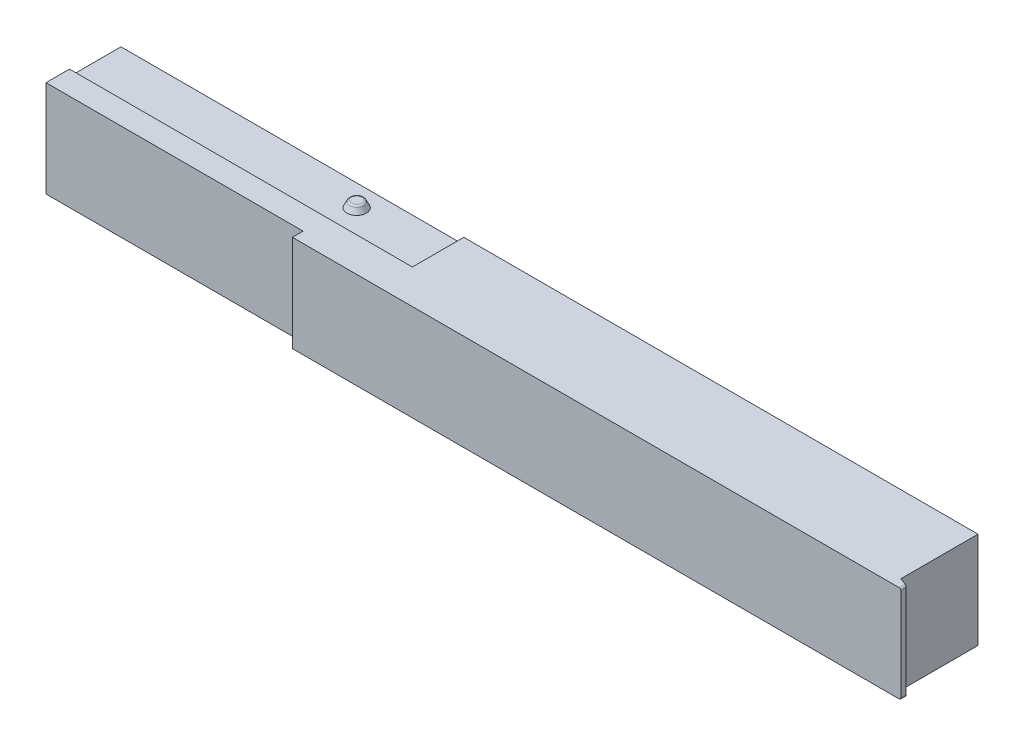
ISO-10303-21;
HEADER;
FILE_DESCRIPTION(('STEP AP214'),'2;1');
FILE_NAME('part.step','',(''),(''),'','','');
FILE_SCHEMA(('AUTOMOTIVE_DESIGN { 1 0 10303 214 1 1 1 1 }'));
ENDSEC;
DATA;
#1=APPLICATION_CONTEXT('core data for automotive mechanical design processes');
#2=APPLICATION_PROTOCOL_DEFINITION('international standard','automotive_design',2000,#1);
#3=PRODUCT_CONTEXT('',#1,'mechanical');
#4=PRODUCT('Part','Part','',(#3));
#5=PRODUCT_RELATED_PRODUCT_CATEGORY('part','',(#4));
#6=PRODUCT_DEFINITION_FORMATION('','',#4);
#7=PRODUCT_DEFINITION_CONTEXT('part definition',#1,'design');
#8=PRODUCT_DEFINITION('design','',#6,#7);
#9=PRODUCT_DEFINITION_SHAPE('','',#8);
#10=(LENGTH_UNIT() NAMED_UNIT(*) SI_UNIT(.MILLI.,.METRE.));
#11=(NAMED_UNIT(*) PLANE_ANGLE_UNIT() SI_UNIT($,.RADIAN.));
#12=(NAMED_UNIT(*) SI_UNIT($,.STERADIAN.) SOLID_ANGLE_UNIT());
#13=UNCERTAINTY_MEASURE_WITH_UNIT(LENGTH_MEASURE(1.E-05),#10,'distance_accuracy_value','');
#14=(GEOMETRIC_REPRESENTATION_CONTEXT(3) GLOBAL_UNCERTAINTY_ASSIGNED_CONTEXT((#13)) GLOBAL_UNIT_ASSIGNED_CONTEXT((#10,
#11,#12)) REPRESENTATION_CONTEXT('',''));
#15=CARTESIAN_POINT('',(0.,0.,0.));
#16=DIRECTION('',(0.,0.,1.));
#17=DIRECTION('',(1.,0.,0.));
#18=AXIS2_PLACEMENT_3D('',#15,#16,#17);
#19=CARTESIAN_POINT('',(-32.6667343634635,15.4764947855641,16.0620123996754));
#20=DIRECTION('',(0.,-1.,0.));
#21=DIRECTION('',(1.,0.,0.));
#22=AXIS2_PLACEMENT_3D('',#19,#20,#21);
#23=PLANE('',#22);
#24=DIRECTION('',(0.,0.,1.));
#25=VECTOR('',#24,1.);
#26=CARTESIAN_POINT('',(-32.6667343634635,15.4764947855641,16.0620123996754));
#27=LINE('',#26,#25);
#28=CARTESIAN_POINT('',(-32.6667343634635,15.4764947855641,28.0620123996754));
#29=VERTEX_POINT('',#28);
#30=CARTESIAN_POINT('',(-32.6667343634635,15.4764947855641,33.5620123996754));
#31=VERTEX_POINT('',#30);
#32=EDGE_CURVE('E277',#29,#31,#27,.T.);
#33=ORIENTED_EDGE('',*,*,#32,.F.);
#34=DIRECTION('',(1.,0.,0.));
#35=VECTOR('',#34,1.);
#36=CARTESIAN_POINT('',(-32.6667343634635,15.4764947855641,28.0620123996754));
#37=LINE('',#36,#35);
#38=CARTESIAN_POINT('',(47.3332656365365,15.4764947855641,28.0620123996754));
#39=VERTEX_POINT('',#38);
#40=EDGE_CURVE('E467',#29,#39,#37,.T.);
#41=ORIENTED_EDGE('',*,*,#40,.T.);
#42=DIRECTION('',(0.,0.,-1.));
#43=VECTOR('',#42,1.);
#44=CARTESIAN_POINT('',(47.3332656365365,15.4764947855641,16.0620123996754));
#45=LINE('',#44,#43);
#46=CARTESIAN_POINT('',(47.3332656365365,15.4764947855641,16.0620123996754));
#47=VERTEX_POINT('',#46);
#48=EDGE_CURVE('E471',#39,#47,#45,.T.);
#49=ORIENTED_EDGE('',*,*,#48,.T.);
#50=DIRECTION('',(1.,0.,0.));
#51=VECTOR('',#50,1.);
#52=CARTESIAN_POINT('',(-32.6667343634635,15.4764947855641,16.0620123996754));
#53=LINE('',#52,#51);
#54=CARTESIAN_POINT('',(167.333265636537,15.4764947855641,16.0620123996754));
#55=VERTEX_POINT('',#54);
#56=EDGE_CURVE('E191',#47,#55,#53,.T.);
#57=ORIENTED_EDGE('',*,*,#56,.T.);
#58=DIRECTION('',(0.,0.,1.));
#59=VECTOR('',#58,1.);
#60=CARTESIAN_POINT('',(167.333265636537,15.4764947855641,16.0620123996754));
#61=LINE('',#60,#59);
#62=CARTESIAN_POINT('',(167.333265636537,15.4764947855641,34.084071931143));
#63=VERTEX_POINT('',#62);
#64=EDGE_CURVE('E256',#55,#63,#61,.T.);
#65=ORIENTED_EDGE('',*,*,#64,.T.);
#66=DIRECTION('',(-0.939692620785909,0.,-0.342020143325667));
#67=VECTOR('',#66,1.);
#68=CARTESIAN_POINT('',(-15.0633569592918,15.4764947855641,-32.3028695244243));
#69=LINE('',#68,#67);
#70=CARTESIAN_POINT('',(168.933265636536,15.4764947855641,34.6664243059689));
#71=VERTEX_POINT('',#70);
#72=EDGE_CURVE('E298',#63,#71,#69,.F.);
#73=ORIENTED_EDGE('',*,*,#72,.T.);
#74=DIRECTION('',(0.,0.,1.));
#75=VECTOR('',#74,1.);
#76=CARTESIAN_POINT('',(168.933265636536,15.4764947855641,16.0620123996754));
#77=LINE('',#76,#75);
#78=CARTESIAN_POINT('',(168.933265636536,15.4764947855641,36.0620123996754));
#79=VERTEX_POINT('',#78);
#80=EDGE_CURVE('E306',#71,#79,#77,.T.);
#81=ORIENTED_EDGE('',*,*,#80,.T.);
#82=DIRECTION('',(1.,0.,0.));
#83=VECTOR('',#82,1.);
#84=CARTESIAN_POINT('',(-32.6667343634635,15.4764947855641,36.0620123996754));
#85=LINE('',#84,#83);
#86=CARTESIAN_POINT('',(27.3332656365365,15.4764947855641,36.0620123996754));
#87=VERTEX_POINT('',#86);
#88=EDGE_CURVE('E272',#87,#79,#85,.T.);
#89=ORIENTED_EDGE('',*,*,#88,.F.);
#90=DIRECTION('',(0.,0.,-1.));
#91=VECTOR('',#90,1.);
#92=CARTESIAN_POINT('',(27.3332656365365,15.4764947855641,36.0620123996754));
#93=LINE('',#92,#91);
#94=CARTESIAN_POINT('',(27.3332656365365,15.4764947855641,33.5620123996754));
#95=VERTEX_POINT('',#94);
#96=EDGE_CURVE('E238',#87,#95,#93,.T.);
#97=ORIENTED_EDGE('',*,*,#96,.T.);
#98=DIRECTION('',(-1.,0.,0.));
#99=VECTOR('',#98,1.);
#100=CARTESIAN_POINT('',(27.3332656365365,15.4764947855641,33.5620123996754));
#101=LINE('',#100,#99);
#102=EDGE_CURVE('E243',#95,#31,#101,.T.);
#103=ORIENTED_EDGE('',*,*,#102,.T.);
#104=EDGE_LOOP('',(#33,#41,#49,#57,#65,#73,#81,#89,#97,#103));
#105=FACE_BOUND('',#104,.T.);
#106=ADVANCED_FACE('F55',(#105),#23,.T.);
#107=CARTESIAN_POINT('',(-32.6667343634635,15.4764947855641,16.0620123996754));
#108=DIRECTION('',(1.,0.,0.));
#109=DIRECTION('',(0.,0.,-1.));
#110=AXIS2_PLACEMENT_3D('',#107,#108,#109);
#111=PLANE('',#110);
#112=DIRECTION('',(0.,-1.,0.));
#113=VECTOR('',#112,1.);
#114=CARTESIAN_POINT('',(-32.6667343634635,16.9764947855641,28.0620123996754));
#115=LINE('',#114,#113);
#116=CARTESIAN_POINT('',(-32.6667343634635,16.9764947855641,28.0620123996754));
#117=VERTEX_POINT('',#116);
#118=EDGE_CURVE('E196',#117,#29,#115,.T.);
#119=ORIENTED_EDGE('',*,*,#118,.T.);
#120=ORIENTED_EDGE('',*,*,#32,.T.);
#121=DIRECTION('',(0.,1.,0.));
#122=VECTOR('',#121,1.);
#123=CARTESIAN_POINT('',(-32.6667343634635,-44.5755659617575,33.5620123996754));
#124=LINE('',#123,#122);
#125=CARTESIAN_POINT('',(-32.6667343634635,37.9764947855641,33.5620123996754));
#126=VERTEX_POINT('',#125);
#127=EDGE_CURVE('E247',#31,#126,#124,.T.);
#128=ORIENTED_EDGE('',*,*,#127,.T.);
#129=DIRECTION('',(0.,0.,1.));
#130=VECTOR('',#129,1.);
#131=CARTESIAN_POINT('',(-32.6667343634635,37.9764947855641,16.0620123996754));
#132=LINE('',#131,#130);
#133=CARTESIAN_POINT('',(-32.6667343634635,37.9764947855641,28.0620123996754));
#134=VERTEX_POINT('',#133);
#135=EDGE_CURVE('E288',#134,#126,#132,.T.);
#136=ORIENTED_EDGE('',*,*,#135,.F.);
#137=DIRECTION('',(0.,1.,0.));
#138=VECTOR('',#137,1.);
#139=CARTESIAN_POINT('',(-32.6667343634635,36.4764947855641,28.0620123996754));
#140=LINE('',#139,#138);
#141=CARTESIAN_POINT('',(-32.6667343634635,36.4764947855641,28.0620123996754));
#142=VERTEX_POINT('',#141);
#143=EDGE_CURVE('E214',#142,#134,#140,.T.);
#144=ORIENTED_EDGE('',*,*,#143,.F.);
#145=DIRECTION('',(0.,0.,1.));
#146=VECTOR('',#145,1.);
#147=CARTESIAN_POINT('',(-32.6667343634635,36.4764947855641,16.0620123996754));
#148=LINE('',#147,#146);
#149=CARTESIAN_POINT('',(-32.6667343634635,36.4764947855641,16.0620123996754));
#150=VERTEX_POINT('',#149);
#151=EDGE_CURVE('E201',#150,#142,#148,.T.);
#152=ORIENTED_EDGE('',*,*,#151,.F.);
#153=DIRECTION('',(0.,1.,0.));
#154=VECTOR('',#153,1.);
#155=CARTESIAN_POINT('',(-32.6667343634635,15.4764947855641,16.0620123996754));
#156=LINE('',#155,#154);
#157=CARTESIAN_POINT('',(-32.6667343634635,16.9764947855641,16.0620123996754));
#158=VERTEX_POINT('',#157);
#159=EDGE_CURVE('E268',#158,#150,#156,.T.);
#160=ORIENTED_EDGE('',*,*,#159,.F.);
#161=DIRECTION('',(0.,0.,1.));
#162=VECTOR('',#161,1.);
#163=CARTESIAN_POINT('',(-32.6667343634635,16.9764947855641,16.0620123996754));
#164=LINE('',#163,#162);
#165=EDGE_CURVE('E71',#158,#117,#164,.T.);
#166=ORIENTED_EDGE('',*,*,#165,.T.);
#167=EDGE_LOOP('',(#119,#120,#128,#136,#144,#152,#160,#166));
#168=FACE_BOUND('',#167,.T.);
#169=ADVANCED_FACE('F416',(#168),#111,.F.);
#170=CARTESIAN_POINT('',(-32.6667343634635,15.4764947855641,16.0620123996754));
#171=DIRECTION('',(0.,0.,-1.));
#172=DIRECTION('',(-1.,0.,0.));
#173=AXIS2_PLACEMENT_3D('',#170,#171,#172);
#174=PLANE('',#173);
#175=ORIENTED_EDGE('',*,*,#56,.F.);
#176=DIRECTION('',(0.,-1.,0.));
#177=VECTOR('',#176,1.);
#178=CARTESIAN_POINT('',(47.3332656365365,16.9764947855641,16.0620123996754));
#179=LINE('',#178,#177);
#180=CARTESIAN_POINT('',(47.3332656365365,16.9764947855641,16.0620123996754));
#181=VERTEX_POINT('',#180);
#182=EDGE_CURVE('E176',#181,#47,#179,.T.);
#183=ORIENTED_EDGE('',*,*,#182,.F.);
#184=DIRECTION('',(-1.,0.,0.));
#185=VECTOR('',#184,1.);
#186=CARTESIAN_POINT('',(-32.6667343634635,16.9764947855641,16.0620123996754));
#187=LINE('',#186,#185);
#188=EDGE_CURVE('E181',#181,#158,#187,.T.);
#189=ORIENTED_EDGE('',*,*,#188,.T.);
#190=ORIENTED_EDGE('',*,*,#159,.T.);
#191=DIRECTION('',(-1.,0.,0.));
#192=VECTOR('',#191,1.);
#193=CARTESIAN_POINT('',(-32.6667343634635,36.4764947855641,16.0620123996754));
#194=LINE('',#193,#192);
#195=CARTESIAN_POINT('',(47.3332656365365,36.4764947855641,16.0620123996754));
#196=VERTEX_POINT('',#195);
#197=EDGE_CURVE('E211',#196,#150,#194,.T.);
#198=ORIENTED_EDGE('',*,*,#197,.F.);
#199=DIRECTION('',(0.,1.,0.));
#200=VECTOR('',#199,1.);
#201=CARTESIAN_POINT('',(47.3332656365365,36.4764947855641,16.0620123996754));
#202=LINE('',#201,#200);
#203=CARTESIAN_POINT('',(47.3332656365365,37.9764947855641,16.0620123996754));
#204=VERTEX_POINT('',#203);
#205=EDGE_CURVE('E221',#196,#204,#202,.T.);
#206=ORIENTED_EDGE('',*,*,#205,.T.);
#207=DIRECTION('',(1.,0.,0.));
#208=VECTOR('',#207,1.);
#209=CARTESIAN_POINT('',(-32.6667343634635,37.9764947855641,16.0620123996754));
#210=LINE('',#209,#208);
#211=CARTESIAN_POINT('',(167.333265636537,37.9764947855641,16.0620123996754));
#212=VERTEX_POINT('',#211);
#213=EDGE_CURVE('E271',#204,#212,#210,.T.);
#214=ORIENTED_EDGE('',*,*,#213,.T.);
#215=DIRECTION('',(0.,1.,0.));
#216=VECTOR('',#215,1.);
#217=CARTESIAN_POINT('',(167.333265636537,15.4764947855641,16.0620123996754));
#218=LINE('',#217,#216);
#219=EDGE_CURVE('E263',#55,#212,#218,.T.);
#220=ORIENTED_EDGE('',*,*,#219,.F.);
#221=EDGE_LOOP('',(#175,#183,#189,#190,#198,#206,#214,#220));
#222=FACE_BOUND('',#221,.T.);
#223=ADVANCED_FACE('F189',(#222),#174,.T.);
#224=CARTESIAN_POINT('',(-32.6667343634635,37.9764947855641,16.0620123996754));
#225=DIRECTION('',(0.,-1.,0.));
#226=DIRECTION('',(1.,0.,0.));
#227=AXIS2_PLACEMENT_3D('',#224,#225,#226);
#228=PLANE('',#227);
#229=ORIENTED_EDGE('',*,*,#213,.F.);
#230=DIRECTION('',(0.,0.,-1.));
#231=VECTOR('',#230,1.);
#232=CARTESIAN_POINT('',(47.3332656365365,37.9764947855641,16.0620123996754));
#233=LINE('',#232,#231);
#234=CARTESIAN_POINT('',(47.3332656365365,37.9764947855641,28.0620123996754));
#235=VERTEX_POINT('',#234);
#236=EDGE_CURVE('E206',#235,#204,#233,.T.);
#237=ORIENTED_EDGE('',*,*,#236,.F.);
#238=DIRECTION('',(1.,0.,0.));
#239=VECTOR('',#238,1.);
#240=CARTESIAN_POINT('',(-32.6667343634635,37.9764947855641,28.0620123996754));
#241=LINE('',#240,#239);
#242=EDGE_CURVE('E215',#134,#235,#241,.T.);
#243=ORIENTED_EDGE('',*,*,#242,.F.);
#244=ORIENTED_EDGE('',*,*,#135,.T.);
#245=DIRECTION('',(-1.,0.,0.));
#246=VECTOR('',#245,1.);
#247=CARTESIAN_POINT('',(27.3332656365365,37.9764947855641,33.5620123996754));
#248=LINE('',#247,#246);
#249=CARTESIAN_POINT('',(27.3332656365365,37.9764947855641,33.5620123996754));
#250=VERTEX_POINT('',#249);
#251=EDGE_CURVE('E234',#250,#126,#248,.T.);
#252=ORIENTED_EDGE('',*,*,#251,.F.);
#253=DIRECTION('',(0.,0.,-1.));
#254=VECTOR('',#253,1.);
#255=CARTESIAN_POINT('',(27.3332656365365,37.9764947855641,36.0620123996754));
#256=LINE('',#255,#254);
#257=CARTESIAN_POINT('',(27.3332656365365,37.9764947855641,36.0620123996754));
#258=VERTEX_POINT('',#257);
#259=EDGE_CURVE('E225',#258,#250,#256,.T.);
#260=ORIENTED_EDGE('',*,*,#259,.F.);
#261=DIRECTION('',(1.,0.,0.));
#262=VECTOR('',#261,1.);
#263=CARTESIAN_POINT('',(-32.6667343634635,37.9764947855641,36.0620123996754));
#264=LINE('',#263,#262);
#265=CARTESIAN_POINT('',(168.933265636536,37.9764947855641,36.0620123996754));
#266=VERTEX_POINT('',#265);
#267=EDGE_CURVE('E267',#258,#266,#264,.T.);
#268=ORIENTED_EDGE('',*,*,#267,.T.);
#269=DIRECTION('',(0.,0.,1.));
#270=VECTOR('',#269,1.);
#271=CARTESIAN_POINT('',(168.933265636536,37.9764947855641,34.8120123996754));
#272=LINE('',#271,#270);
#273=CARTESIAN_POINT('',(168.933265636536,37.9764947855641,34.6664243059689));
#274=VERTEX_POINT('',#273);
#275=EDGE_CURVE('E330',#266,#274,#272,.F.);
#276=ORIENTED_EDGE('',*,*,#275,.T.);
#277=DIRECTION('',(0.939692620785909,0.,0.342020143325667));
#278=VECTOR('',#277,1.);
#279=CARTESIAN_POINT('',(169.333265636537,37.9764947855641,34.8120123996754));
#280=LINE('',#279,#278);
#281=CARTESIAN_POINT('',(167.333265636537,37.9764947855641,34.084071931143));
#282=VERTEX_POINT('',#281);
#283=EDGE_CURVE('E295',#274,#282,#280,.F.);
#284=ORIENTED_EDGE('',*,*,#283,.T.);
#285=DIRECTION('',(0.,0.,1.));
#286=VECTOR('',#285,1.);
#287=CARTESIAN_POINT('',(167.333265636537,37.9764947855641,16.0620123996754));
#288=LINE('',#287,#286);
#289=EDGE_CURVE('E259',#212,#282,#288,.T.);
#290=ORIENTED_EDGE('',*,*,#289,.F.);
#291=EDGE_LOOP('',(#229,#237,#243,#244,#252,#260,#268,#276,#284,#290));
#292=FACE_BOUND('',#291,.T.);
#293=ADVANCED_FACE('F415',(#292),#228,.F.);
#294=CARTESIAN_POINT('',(169.333265636537,15.4764947855641,16.0620123996754));
#295=DIRECTION('',(1.,0.,0.));
#296=DIRECTION('',(0.,0.,-1.));
#297=AXIS2_PLACEMENT_3D('',#294,#295,#296);
#298=PLANE('',#297);
#299=DIRECTION('',(0.,1.,0.));
#300=VECTOR('',#299,1.);
#301=CARTESIAN_POINT('',(169.333265636537,15.4764947855641,36.0620123996754));
#302=LINE('',#301,#300);
#303=CARTESIAN_POINT('',(169.333265636537,15.8764947855641,36.0620123996754));
#304=VERTEX_POINT('',#303);
#305=CARTESIAN_POINT('',(169.333265636537,37.5764947855641,36.0620123996754));
#306=VERTEX_POINT('',#305);
#307=EDGE_CURVE('E280',#304,#306,#302,.T.);
#308=ORIENTED_EDGE('',*,*,#307,.F.);
#309=DIRECTION('',(0.,0.,1.));
#310=VECTOR('',#309,1.);
#311=CARTESIAN_POINT('',(169.333265636537,15.8764947855641,16.0620123996754));
#312=LINE('',#311,#310);
#313=CARTESIAN_POINT('',(169.333265636537,15.8764947855641,34.8120123996754));
#314=VERTEX_POINT('',#313);
#315=EDGE_CURVE('E321',#304,#314,#312,.F.);
#316=ORIENTED_EDGE('',*,*,#315,.T.);
#317=DIRECTION('',(0.,1.,0.));
#318=VECTOR('',#317,1.);
#319=CARTESIAN_POINT('',(169.333265636537,15.4764947855641,34.8120123996754));
#320=LINE('',#319,#318);
#321=CARTESIAN_POINT('',(169.333265636537,37.5764947855641,34.8120123996754));
#322=VERTEX_POINT('',#321);
#323=EDGE_CURVE('E291',#314,#322,#320,.T.);
#324=ORIENTED_EDGE('',*,*,#323,.T.);
#325=DIRECTION('',(0.,0.,1.));
#326=VECTOR('',#325,1.);
#327=CARTESIAN_POINT('',(169.333265636537,37.5764947855641,36.0620123996754));
#328=LINE('',#327,#326);
#329=EDGE_CURVE('E317',#322,#306,#328,.T.);
#330=ORIENTED_EDGE('',*,*,#329,.T.);
#331=EDGE_LOOP('',(#308,#316,#324,#330));
#332=FACE_BOUND('',#331,.T.);
#333=ADVANCED_FACE('F419',(#332),#298,.T.);
#334=CARTESIAN_POINT('',(-32.6667343634635,15.4764947855641,36.0620123996754));
#335=DIRECTION('',(0.,0.,-1.));
#336=DIRECTION('',(-1.,0.,0.));
#337=AXIS2_PLACEMENT_3D('',#334,#335,#336);
#338=PLANE('',#337);
#339=ORIENTED_EDGE('',*,*,#267,.F.);
#340=DIRECTION('',(0.,1.,0.));
#341=VECTOR('',#340,1.);
#342=CARTESIAN_POINT('',(27.3332656365365,-44.5755659617575,36.0620123996754));
#343=LINE('',#342,#341);
#344=EDGE_CURVE('E251',#87,#258,#343,.T.);
#345=ORIENTED_EDGE('',*,*,#344,.F.);
#346=ORIENTED_EDGE('',*,*,#88,.T.);
#347=CARTESIAN_POINT('',(168.933265636536,15.8764947855641,36.0620123996754));
#348=DIRECTION('',(0.,0.,-1.));
#349=DIRECTION('',(-1.,0.,0.));
#350=AXIS2_PLACEMENT_3D('',#347,#348,#349);
#351=CIRCLE('',#350,0.4);
#352=EDGE_CURVE('E314',#79,#304,#351,.F.);
#353=ORIENTED_EDGE('',*,*,#352,.T.);
#354=ORIENTED_EDGE('',*,*,#307,.T.);
#355=CARTESIAN_POINT('',(168.933265636536,37.5764947855641,36.0620123996754));
#356=DIRECTION('',(0.,0.,-1.));
#357=DIRECTION('',(-1.,0.,0.));
#358=AXIS2_PLACEMENT_3D('',#355,#356,#357);
#359=CIRCLE('',#358,0.4);
#360=EDGE_CURVE('E310',#306,#266,#359,.F.);
#361=ORIENTED_EDGE('',*,*,#360,.T.);
#362=EDGE_LOOP('',(#339,#345,#346,#353,#354,#361));
#363=FACE_BOUND('',#362,.T.);
#364=ADVANCED_FACE('F411',(#363),#338,.F.);
#365=CARTESIAN_POINT('',(167.333265636537,15.4764947855641,36.0620123996754));
#366=DIRECTION('',(-1.,0.,0.));
#367=DIRECTION('',(0.,0.,1.));
#368=AXIS2_PLACEMENT_3D('',#365,#366,#367);
#369=PLANE('',#368);
#370=ORIENTED_EDGE('',*,*,#64,.F.);
#371=ORIENTED_EDGE('',*,*,#219,.T.);
#372=ORIENTED_EDGE('',*,*,#289,.T.);
#373=DIRECTION('',(0.,1.,0.));
#374=VECTOR('',#373,1.);
#375=CARTESIAN_POINT('',(167.333265636537,15.4764947855641,34.084071931143));
#376=LINE('',#375,#374);
#377=EDGE_CURVE('E302',#282,#63,#376,.F.);
#378=ORIENTED_EDGE('',*,*,#377,.T.);
#379=EDGE_LOOP('',(#370,#371,#372,#378));
#380=FACE_BOUND('',#379,.T.);
#381=ADVANCED_FACE('F407',(#380),#369,.F.);
#382=CARTESIAN_POINT('',(169.333265636537,15.4764947855641,34.8120123996754));
#383=DIRECTION('',(-0.342020143325667,0.,0.939692620785909));
#384=DIRECTION('',(0.,1.,0.));
#385=AXIS2_PLACEMENT_3D('',#382,#383,#384);
#386=PLANE('',#385);
#387=ORIENTED_EDGE('',*,*,#323,.F.);
#388=CARTESIAN_POINT('',(168.933265636536,15.8764947855641,34.6664243059689));
#389=DIRECTION('',(-0.342020143325667,0.,0.939692620785909));
#390=DIRECTION('',(0.939692620785909,0.,0.342020143325667));
#391=AXIS2_PLACEMENT_3D('',#388,#389,#390);
#392=ELLIPSE('',#391,0.425671108990365,0.4);
#393=EDGE_CURVE('E327',#314,#71,#392,.F.);
#394=ORIENTED_EDGE('',*,*,#393,.T.);
#395=ORIENTED_EDGE('',*,*,#72,.F.);
#396=ORIENTED_EDGE('',*,*,#377,.F.);
#397=ORIENTED_EDGE('',*,*,#283,.F.);
#398=CARTESIAN_POINT('',(168.933265636536,37.5764947855641,34.6664243059689));
#399=DIRECTION('',(-0.342020143325667,0.,0.939692620785909));
#400=DIRECTION('',(-0.939692620785909,0.,-0.342020143325667));
#401=AXIS2_PLACEMENT_3D('',#398,#399,#400);
#402=ELLIPSE('',#401,0.425671108990365,0.4);
#403=EDGE_CURVE('E324',#274,#322,#402,.F.);
#404=ORIENTED_EDGE('',*,*,#403,.T.);
#405=EDGE_LOOP('',(#387,#394,#395,#396,#397,#404));
#406=FACE_BOUND('',#405,.T.);
#407=ADVANCED_FACE('F410',(#406),#386,.F.);
#408=CARTESIAN_POINT('',(168.933265636536,15.8764947855641,16.0620123996754));
#409=DIRECTION('',(0.,0.,1.));
#410=DIRECTION('',(1.,0.,0.));
#411=AXIS2_PLACEMENT_3D('',#408,#409,#410);
#412=CYLINDRICAL_SURFACE('',#411,0.4);
#413=ORIENTED_EDGE('',*,*,#393,.F.);
#414=ORIENTED_EDGE('',*,*,#315,.F.);
#415=ORIENTED_EDGE('',*,*,#352,.F.);
#416=ORIENTED_EDGE('',*,*,#80,.F.);
#417=EDGE_LOOP('',(#413,#414,#415,#416));
#418=FACE_BOUND('',#417,.T.);
#419=ADVANCED_FACE('F438',(#418),#412,.T.);
#420=CARTESIAN_POINT('',(168.933265636536,37.5764947855641,16.0620123996754));
#421=DIRECTION('',(0.,0.,-1.));
#422=DIRECTION('',(-1.,0.,0.));
#423=AXIS2_PLACEMENT_3D('',#420,#421,#422);
#424=CYLINDRICAL_SURFACE('',#423,0.4);
#425=ORIENTED_EDGE('',*,*,#403,.F.);
#426=ORIENTED_EDGE('',*,*,#275,.F.);
#427=ORIENTED_EDGE('',*,*,#360,.F.);
#428=ORIENTED_EDGE('',*,*,#329,.F.);
#429=EDGE_LOOP('',(#425,#426,#427,#428));
#430=FACE_BOUND('',#429,.T.);
#431=ADVANCED_FACE('F405',(#430),#424,.T.);
#432=CARTESIAN_POINT('',(27.3332656365365,-44.5755659617575,36.0620123996754));
#433=DIRECTION('',(1.,0.,0.));
#434=DIRECTION('',(0.,1.,0.));
#435=AXIS2_PLACEMENT_3D('',#432,#433,#434);
#436=PLANE('',#435);
#437=ORIENTED_EDGE('',*,*,#344,.T.);
#438=ORIENTED_EDGE('',*,*,#259,.T.);
#439=DIRECTION('',(0.,1.,0.));
#440=VECTOR('',#439,1.);
#441=CARTESIAN_POINT('',(27.3332656365365,-44.5755659617575,33.5620123996754));
#442=LINE('',#441,#440);
#443=EDGE_CURVE('E242',#95,#250,#442,.T.);
#444=ORIENTED_EDGE('',*,*,#443,.F.);
#445=ORIENTED_EDGE('',*,*,#96,.F.);
#446=EDGE_LOOP('',(#437,#438,#444,#445));
#447=FACE_BOUND('',#446,.T.);
#448=ADVANCED_FACE('F401',(#447),#436,.F.);
#449=CARTESIAN_POINT('',(27.3332656365365,-44.5755659617575,33.5620123996754));
#450=DIRECTION('',(0.,0.,-1.));
#451=DIRECTION('',(-1.,0.,0.));
#452=AXIS2_PLACEMENT_3D('',#449,#450,#451);
#453=PLANE('',#452);
#454=ORIENTED_EDGE('',*,*,#443,.T.);
#455=ORIENTED_EDGE('',*,*,#251,.T.);
#456=ORIENTED_EDGE('',*,*,#127,.F.);
#457=ORIENTED_EDGE('',*,*,#102,.F.);
#458=EDGE_LOOP('',(#454,#455,#456,#457));
#459=FACE_BOUND('',#458,.T.);
#460=ADVANCED_FACE('F394',(#459),#453,.F.);
#461=CARTESIAN_POINT('',(47.3332656365365,36.4764947855641,16.0620123996754));
#462=DIRECTION('',(1.,0.,0.));
#463=DIRECTION('',(0.,1.,0.));
#464=AXIS2_PLACEMENT_3D('',#461,#462,#463);
#465=PLANE('',#464);
#466=ORIENTED_EDGE('',*,*,#236,.T.);
#467=ORIENTED_EDGE('',*,*,#205,.F.);
#468=DIRECTION('',(0.,0.,-1.));
#469=VECTOR('',#468,1.);
#470=CARTESIAN_POINT('',(47.3332656365365,36.4764947855641,16.0620123996754));
#471=LINE('',#470,#469);
#472=CARTESIAN_POINT('',(47.3332656365365,36.4764947855641,28.0620123996754));
#473=VERTEX_POINT('',#472);
#474=EDGE_CURVE('E79',#473,#196,#471,.T.);
#475=ORIENTED_EDGE('',*,*,#474,.F.);
#476=DIRECTION('',(0.,1.,0.));
#477=VECTOR('',#476,1.);
#478=CARTESIAN_POINT('',(47.3332656365365,36.4764947855641,28.0620123996754));
#479=LINE('',#478,#477);
#480=EDGE_CURVE('E226',#473,#235,#479,.T.);
#481=ORIENTED_EDGE('',*,*,#480,.T.);
#482=EDGE_LOOP('',(#466,#467,#475,#481));
#483=FACE_BOUND('',#482,.T.);
#484=ADVANCED_FACE('F391',(#483),#465,.F.);
#485=CARTESIAN_POINT('',(-32.6667343634635,36.4764947855641,28.0620123996754));
#486=DIRECTION('',(0.,0.,1.));
#487=DIRECTION('',(1.,0.,0.));
#488=AXIS2_PLACEMENT_3D('',#485,#486,#487);
#489=PLANE('',#488);
#490=ORIENTED_EDGE('',*,*,#242,.T.);
#491=ORIENTED_EDGE('',*,*,#480,.F.);
#492=DIRECTION('',(1.,0.,0.));
#493=VECTOR('',#492,1.);
#494=CARTESIAN_POINT('',(-32.6667343634635,36.4764947855641,28.0620123996754));
#495=LINE('',#494,#493);
#496=EDGE_CURVE('E205',#142,#473,#495,.T.);
#497=ORIENTED_EDGE('',*,*,#496,.F.);
#498=ORIENTED_EDGE('',*,*,#143,.T.);
#499=EDGE_LOOP('',(#490,#491,#497,#498));
#500=FACE_BOUND('',#499,.T.);
#501=ADVANCED_FACE('F389',(#500),#489,.F.);
#502=CARTESIAN_POINT('',(0.,36.4764947855641,0.));
#503=DIRECTION('',(0.,1.,0.));
#504=DIRECTION('',(-1.,0.,0.));
#505=AXIS2_PLACEMENT_3D('',#502,#503,#504);
#506=PLANE('',#505);
#507=CARTESIAN_POINT('',(27.3332656365365,36.4764947855641,21.0620123996754));
#508=DIRECTION('',(0.,1.,0.));
#509=DIRECTION('',(0.,0.,1.));
#510=AXIS2_PLACEMENT_3D('',#507,#508,#509);
#511=CIRCLE('',#510,2.25);
#512=CARTESIAN_POINT('',(27.6124600519049,36.4764947855641,18.829401712962));
#513=VERTEX_POINT('',#512);
#514=EDGE_CURVE('E333',#513,#513,#511,.T.);
#515=ORIENTED_EDGE('',*,*,#514,.F.);
#516=EDGE_LOOP('',(#515));
#517=FACE_BOUND('',#516,.T.);
#518=ORIENTED_EDGE('',*,*,#151,.T.);
#519=ORIENTED_EDGE('',*,*,#496,.T.);
#520=ORIENTED_EDGE('',*,*,#474,.T.);
#521=ORIENTED_EDGE('',*,*,#197,.T.);
#522=EDGE_LOOP('',(#518,#519,#520,#521));
#523=FACE_BOUND('',#522,.T.);
#524=ADVANCED_FACE('F385',(#517,#523),#506,.T.);
#525=CARTESIAN_POINT('',(27.3332656365365,37.9764947855641,21.0620123996754));
#526=DIRECTION('',(0.,1.,0.));
#527=DIRECTION('',(-1.,0.,0.));
#528=AXIS2_PLACEMENT_3D('',#525,#526,#527);
#529=PLANE('',#528);
#530=CARTESIAN_POINT('',(27.3332656365365,37.9764947855641,21.0620123996754));
#531=DIRECTION('',(0.,1.,0.));
#532=DIRECTION('',(-1.,0.,0.));
#533=AXIS2_PLACEMENT_3D('',#530,#531,#532);
#534=CIRCLE('',#533,1.18208903806486);
#535=CARTESIAN_POINT('',(26.1511765984716,37.9764947855641,21.0620123996754));
#536=VERTEX_POINT('',#535);
#537=EDGE_CURVE('E337',#536,#536,#534,.T.);
#538=ORIENTED_EDGE('',*,*,#537,.T.);
#539=EDGE_LOOP('',(#538));
#540=FACE_BOUND('',#539,.T.);
#541=ADVANCED_FACE('F376',(#540),#529,.T.);
#542=CARTESIAN_POINT('',(27.6124600519049,36.4764947855641,18.829401712962));
#543=CARTESIAN_POINT('',(27.8661218643876,37.9764947855641,19.6598482721781));
#544=CARTESIAN_POINT('',(23.147238678478,36.4764947855641,18.2710128822251));
#545=CARTESIAN_POINT('',(25.061793609393,37.9764947855641,18.5941358164758));
#546=CARTESIAN_POINT('',(22.5888498477411,36.4764947855641,22.7362342556519));
#547=CARTESIAN_POINT('',(23.9960811536907,37.9764947855641,21.3984640714704));
#548=CARTESIAN_POINT('',(27.054071221168,36.4764947855641,23.2946230863888));
#549=CARTESIAN_POINT('',(26.8004094086853,37.9764947855641,22.4641765271727));
#550=CARTESIAN_POINT('',(31.5192925945949,36.4764947855641,23.8530119171257));
#551=CARTESIAN_POINT('',(29.6047376636799,37.9764947855641,23.529888982875));
#552=CARTESIAN_POINT('',(32.0776814253318,36.4764947855641,19.3877905436989));
#553=CARTESIAN_POINT('',(30.6704501193822,37.9764947855641,20.7255607278804));
#554=CARTESIAN_POINT('',(27.6124600519049,36.4764947855641,18.829401712962));
#555=CARTESIAN_POINT('',(27.8661218643876,37.9764947855641,19.6598482721781));
#556=(BOUNDED_SURFACE() B_SPLINE_SURFACE(3,1,((#542,#543),(#544,#545),(#546,#547),(#548,#549),
(#550,#551),(#552,#553),(#554,#555)),.UNSPECIFIED.,.T.,.F.,.F.) B_SPLINE_SURFACE_WITH_KNOTS((4,
3,4),(2,2),(0.,0.5,1.),(0.,1.),
.UNSPECIFIED.) GEOMETRIC_REPRESENTATION_ITEM() RATIONAL_B_SPLINE_SURFACE(((1.,1.),
(0.333333333333333,0.333333333333333),(0.333333333333333,0.333333333333333),(1.,1.),
(0.333333333333333,0.333333333333333),(0.333333333333333,0.333333333333333),(1.,1.))) REPRESENTATION_ITEM('') SURFACE());
#557=CARTESIAN_POINT('',(27.3332656365365,37.6923010565701,21.0620123996754));
#558=DIRECTION('',(0.,1.,0.));
#559=DIRECTION('',(0.,0.,1.));
#560=AXIS2_PLACEMENT_3D('',#557,#558,#559);
#561=CIRCLE('',#560,1.63311858631475);
#562=CARTESIAN_POINT('',(27.8180624667924,37.6923010565701,19.5025098025822));
#563=VERTEX_POINT('',#562);
#564=EDGE_CURVE('E341',#563,#563,#561,.F.);
#565=CARTESIAN_POINT('',(27.8180624667924,37.6923010565701,19.5025098025822));
#566=CARTESIAN_POINT('',(27.8159207749706,37.6796364079138,19.495498259982));
#567=CARTESIAN_POINT('',(27.8137790831489,37.6669717592575,19.4884867173818));
#568=CARTESIAN_POINT('',(27.8094956995054,37.6416424619448,19.4744636321813));
#569=CARTESIAN_POINT('',(27.8073540076837,37.6289778132885,19.4674520895811));
#570=CARTESIAN_POINT('',(27.8030706240402,37.6036485159759,19.4534290043807));
#571=CARTESIAN_POINT('',(27.8009289322184,37.5909838673196,19.4464174617805));
#572=CARTESIAN_POINT('',(27.7966455485749,37.565654570007,19.4323943765801));
#573=CARTESIAN_POINT('',(27.7945038567532,37.5529899213507,19.4253828339799));
#574=CARTESIAN_POINT('',(27.7902204731097,37.527660624038,19.4113597487794));
#575=CARTESIAN_POINT('',(27.788078781288,37.5149959753817,19.4043482061792));
#576=CARTESIAN_POINT('',(27.7837953976445,37.4896666780691,19.3903251209788));
#577=CARTESIAN_POINT('',(27.7816537058227,37.4770020294128,19.3833135783786));
#578=CARTESIAN_POINT('',(27.7773703221793,37.4516727321001,19.3692904931782));
#579=CARTESIAN_POINT('',(27.7752286303575,37.4390080834438,19.362278950578));
#580=CARTESIAN_POINT('',(27.770945246714,37.4136787861312,19.3482558653775));
#581=CARTESIAN_POINT('',(27.7688035548923,37.4010141374749,19.3412443227773));
#582=CARTESIAN_POINT('',(27.7645201712488,37.3756848401623,19.3272212375769));
#583=CARTESIAN_POINT('',(27.762378479427,37.363020191506,19.3202096949767));
#584=CARTESIAN_POINT('',(27.7580950957835,37.3376908941933,19.3061866097763));
#585=CARTESIAN_POINT('',(27.7559534039618,37.325026245537,19.2991750671761));
#586=CARTESIAN_POINT('',(27.7516700203183,37.2996969482244,19.2851519819756));
#587=CARTESIAN_POINT('',(27.7495283284966,37.2870322995681,19.2781404393754));
#588=CARTESIAN_POINT('',(27.7452449448531,37.2617030022555,19.264117354175));
#589=CARTESIAN_POINT('',(27.7431032530313,37.2490383535992,19.2571058115748));
#590=CARTESIAN_POINT('',(27.7388198693878,37.2237090562865,19.2430827263744));
#591=CARTESIAN_POINT('',(27.7366781775661,37.2110444076302,19.2360711837742));
#592=CARTESIAN_POINT('',(27.7323947939226,37.1857151103176,19.2220480985738));
#593=CARTESIAN_POINT('',(27.7302531021009,37.1730504616613,19.2150365559735));
#594=CARTESIAN_POINT('',(27.7259697184574,37.1477211643487,19.2010134707731));
#595=CARTESIAN_POINT('',(27.7238280266356,37.1350565156923,19.1940019281729));
#596=CARTESIAN_POINT('',(27.7195446429921,37.1097272183797,19.1799788429725));
#597=CARTESIAN_POINT('',(27.7174029511704,37.0970625697234,19.1729673003723));
#598=CARTESIAN_POINT('',(27.7131195675269,37.0717332724108,19.1589442151719));
#599=CARTESIAN_POINT('',(27.7109778757052,37.0590686237545,19.1519326725716));
#600=CARTESIAN_POINT('',(27.7066944920617,37.0337393264418,19.1379095873712));
#601=CARTESIAN_POINT('',(27.7045528002399,37.0210746777855,19.130898044771));
#602=CARTESIAN_POINT('',(27.7002694165964,36.9957453804729,19.1168749595706));
#603=CARTESIAN_POINT('',(27.6981277247747,36.9830807318166,19.1098634169704));
#604=CARTESIAN_POINT('',(27.6938443411312,36.957751434504,19.09584033177));
#605=CARTESIAN_POINT('',(27.6917026493095,36.9450867858477,19.0888287891697));
#606=CARTESIAN_POINT('',(27.687419265666,36.919757488535,19.0748057039693));
#607=CARTESIAN_POINT('',(27.6852775738442,36.9070928398787,19.0677941613691));
#608=CARTESIAN_POINT('',(27.6809941902007,36.8817635425661,19.0537710761687));
#609=CARTESIAN_POINT('',(27.678852498379,36.8690988939098,19.0467595335685));
#610=CARTESIAN_POINT('',(27.6745691147355,36.8437695965972,19.0327364483681));
#611=CARTESIAN_POINT('',(27.6724274229138,36.8311049479408,19.0257249057679));
#612=CARTESIAN_POINT('',(27.6681440392703,36.8057756506282,19.0117018205674));
#613=CARTESIAN_POINT('',(27.6660023474485,36.7931110019719,19.0046902779672));
#614=CARTESIAN_POINT('',(27.661718963805,36.7677817046593,18.9906671927668));
#615=CARTESIAN_POINT('',(27.6595772719833,36.755117056003,18.9836556501666));
#616=CARTESIAN_POINT('',(27.6552938883398,36.7297877586904,18.9696325649662));
#617=CARTESIAN_POINT('',(27.6531521965181,36.717123110034,18.962621022366));
#618=CARTESIAN_POINT('',(27.6488688128746,36.6917938127214,18.9485979371655));
#619=CARTESIAN_POINT('',(27.6467271210528,36.6791291640651,18.9415863945653));
#620=CARTESIAN_POINT('',(27.6424437374093,36.6537998667525,18.9275633093649));
#621=CARTESIAN_POINT('',(27.6403020455876,36.6411352180962,18.9205517667647));
#622=CARTESIAN_POINT('',(27.6360186619441,36.6158059207835,18.9065286815643));
#623=CARTESIAN_POINT('',(27.6338769701224,36.6031412721272,18.8995171389641));
#624=CARTESIAN_POINT('',(27.6295935864789,36.5778119748146,18.8854940537636));
#625=CARTESIAN_POINT('',(27.6274518946571,36.5651473261583,18.8784825111634));
#626=CARTESIAN_POINT('',(27.6231685110136,36.5398180288457,18.864459425963));
#627=CARTESIAN_POINT('',(27.6210268191919,36.5271533801894,18.8574478833628));
#628=CARTESIAN_POINT('',(27.6167434355484,36.5018240828767,18.8434247981624));
#629=CARTESIAN_POINT('',(27.6146017437267,36.4891594342204,18.8364132555622));
#630=CARTESIAN_POINT('',(27.6124600519049,36.4764947855641,18.829401712962));
#631=B_SPLINE_CURVE_WITH_KNOTS('',3,(#565,#566,#567,#568,#569,#570,#571,#572,#573,#574,#575,
#576,#577,#578,#579,#580,#581,#582,#583,#584,#585,#586,#587,#588,#589,#590,#591,#592,#593,#594,
#595,#596,#597,#598,#599,#600,#601,#602,#603,#604,#605,#606,#607,#608,#609,#610,#611,#612,#613,
#614,#615,#616,#617,#618,#619,#620,#621,#622,#623,#624,#625,#626,#627,#628,#629,#630),
.UNSPECIFIED.,.F.,.F.,(4,2,2,2,2,2,2,2,2,2,2,2,2,2,2,2,2,2,2,2,2,2,2,2,2,2,2,2,2,2,2,2,4),(0.,
0.0439007641361235,0.0878015282722508,0.131702292408372,0.175603056544494,0.219503820680623,
0.263404584816744,0.307305348952868,0.351206113088989,0.395106877225111,0.43900764136124,
0.482908405497355,0.526809169633483,0.570709933769612,0.614610697905727,0.658511462041855,
0.702412226177978,0.746312990314101,0.790213754450229,0.83411451858635,0.878015282722472,
0.921916046858601,0.965816810994722,1.00971757513085,1.05361833926697,1.09751910340309,
1.14141986753921,1.18532063167534,1.22922139581146,1.27312215994758,1.31702292408371,
1.36092368821983,1.40482445235596),.UNSPECIFIED.);
#632=EDGE_CURVE('BSEAM371',#563,#513,#631,.T.);
#633=ORIENTED_EDGE('',*,*,#564,.T.);
#634=ORIENTED_EDGE('',*,*,#514,.T.);
#635=ORIENTED_EDGE('',*,*,#632,.T.);
#636=ORIENTED_EDGE('',*,*,#632,.F.);
#637=EDGE_LOOP('',(#633,#635,#634,#636));
#638=FACE_BOUND('',#637,.T.);
#639=ADVANCED_FACE('F371',(#638),#556,.T.);
#640=CARTESIAN_POINT('',(27.3332656365365,37.4764947855641,21.0620123996754));
#641=DIRECTION('',(0.,1.,0.));
#642=DIRECTION('',(0.,0.,1.));
#643=AXIS2_PLACEMENT_3D('',#640,#641,#642);
#644=TOROIDAL_SURFACE('',#643,1.18208903806486,0.5);
#645=ORIENTED_EDGE('',*,*,#564,.F.);
#646=EDGE_LOOP('',(#645));
#647=FACE_BOUND('',#646,.T.);
#648=ORIENTED_EDGE('',*,*,#537,.F.);
#649=EDGE_LOOP('',(#648));
#650=FACE_BOUND('',#649,.T.);
#651=ADVANCED_FACE('F367',(#647,#650),#644,.T.);
#652=CARTESIAN_POINT('',(-32.6667343634635,16.9764947855641,28.0620123996754));
#653=DIRECTION('',(0.,0.,-1.));
#654=DIRECTION('',(-1.,0.,0.));
#655=AXIS2_PLACEMENT_3D('',#652,#653,#654);
#656=PLANE('',#655);
#657=ORIENTED_EDGE('',*,*,#40,.F.);
#658=ORIENTED_EDGE('',*,*,#118,.F.);
#659=DIRECTION('',(1.,0.,0.));
#660=VECTOR('',#659,1.);
#661=CARTESIAN_POINT('',(-32.6667343634635,16.9764947855641,28.0620123996754));
#662=LINE('',#661,#660);
#663=CARTESIAN_POINT('',(47.3332656365365,16.9764947855641,28.0620123996754));
#664=VERTEX_POINT('',#663);
#665=EDGE_CURVE('E180',#117,#664,#662,.T.);
#666=ORIENTED_EDGE('',*,*,#665,.T.);
#667=DIRECTION('',(0.,-1.,0.));
#668=VECTOR('',#667,1.);
#669=CARTESIAN_POINT('',(47.3332656365365,16.9764947855641,28.0620123996754));
#670=LINE('',#669,#668);
#671=EDGE_CURVE('E178',#664,#39,#670,.T.);
#672=ORIENTED_EDGE('',*,*,#671,.T.);
#673=EDGE_LOOP('',(#657,#658,#666,#672));
#674=FACE_BOUND('',#673,.T.);
#675=ADVANCED_FACE('F364',(#674),#656,.T.);
#676=CARTESIAN_POINT('',(47.3332656365365,16.9764947855641,16.0620123996754));
#677=DIRECTION('',(-1.,0.,0.));
#678=DIRECTION('',(0.,-1.,0.));
#679=AXIS2_PLACEMENT_3D('',#676,#677,#678);
#680=PLANE('',#679);
#681=ORIENTED_EDGE('',*,*,#48,.F.);
#682=ORIENTED_EDGE('',*,*,#671,.F.);
#683=DIRECTION('',(0.,0.,-1.));
#684=VECTOR('',#683,1.);
#685=CARTESIAN_POINT('',(47.3332656365365,16.9764947855641,16.0620123996754));
#686=LINE('',#685,#684);
#687=EDGE_CURVE('E172',#664,#181,#686,.T.);
#688=ORIENTED_EDGE('',*,*,#687,.T.);
#689=ORIENTED_EDGE('',*,*,#182,.T.);
#690=EDGE_LOOP('',(#681,#682,#688,#689));
#691=FACE_BOUND('',#690,.T.);
#692=ADVANCED_FACE('F174',(#691),#680,.T.);
#693=CARTESIAN_POINT('',(0.,16.9764947855641,0.));
#694=DIRECTION('',(0.,-1.,0.));
#695=DIRECTION('',(-1.,0.,0.));
#696=AXIS2_PLACEMENT_3D('',#693,#694,#695);
#697=PLANE('',#696);
#698=CARTESIAN_POINT('',(27.6124600519049,16.9764947855641,18.829401712962));
#699=CARTESIAN_POINT('',(32.0776814253318,16.9764947855641,19.3877905436989));
#700=CARTESIAN_POINT('',(31.5192925945949,16.9764947855641,23.8530119171257));
#701=CARTESIAN_POINT('',(27.054071221168,16.9764947855641,23.2946230863888));
#702=CARTESIAN_POINT('',(22.5888498477411,16.9764947855641,22.7362342556519));
#703=CARTESIAN_POINT('',(23.147238678478,16.9764947855641,18.2710128822251));
#704=CARTESIAN_POINT('',(27.6124600519049,16.9764947855641,18.829401712962));
#705=(BOUNDED_CURVE() B_SPLINE_CURVE(3,(#698,#699,#700,#701,#702,#703,#704),.UNSPECIFIED.,.T.,
.F.) B_SPLINE_CURVE_WITH_KNOTS((4,3,4),(0.,0.5,1.),
.UNSPECIFIED.) CURVE() GEOMETRIC_REPRESENTATION_ITEM() RATIONAL_B_SPLINE_CURVE((1.,
0.333333333333333,0.333333333333333,1.,0.333333333333333,0.333333333333333,1.)) REPRESENTATION_ITEM(''));
#706=CARTESIAN_POINT('',(27.6124600519049,16.9764947855641,18.829401712962));
#707=VERTEX_POINT('',#706);
#708=EDGE_CURVE('E345',#707,#707,#705,.T.);
#709=ORIENTED_EDGE('',*,*,#708,.F.);
#710=EDGE_LOOP('',(#709));
#711=FACE_BOUND('',#710,.T.);
#712=ORIENTED_EDGE('',*,*,#165,.F.);
#713=ORIENTED_EDGE('',*,*,#188,.F.);
#714=ORIENTED_EDGE('',*,*,#687,.F.);
#715=ORIENTED_EDGE('',*,*,#665,.F.);
#716=EDGE_LOOP('',(#712,#713,#714,#715));
#717=FACE_BOUND('',#716,.T.);
#718=ADVANCED_FACE('F183',(#711,#717),#697,.T.);
#719=CARTESIAN_POINT('',(27.3332656365365,15.4764947855641,21.0620123996754));
#720=DIRECTION('',(0.,-1.,0.));
#721=DIRECTION('',(-1.,0.,0.));
#722=AXIS2_PLACEMENT_3D('',#719,#720,#721);
#723=PLANE('',#722);
#724=CARTESIAN_POINT('',(27.3332656365365,15.4764947855641,21.0620123996754));
#725=DIRECTION('',(0.,-1.,0.));
#726=DIRECTION('',(1.,0.,0.));
#727=AXIS2_PLACEMENT_3D('',#724,#725,#726);
#728=CIRCLE('',#727,1.18208903806487);
#729=CARTESIAN_POINT('',(28.5153546746013,15.4764947855641,21.0620123996754));
#730=VERTEX_POINT('',#729);
#731=EDGE_CURVE('E12',#730,#730,#728,.T.);
#732=ORIENTED_EDGE('',*,*,#731,.T.);
#733=EDGE_LOOP('',(#732));
#734=FACE_BOUND('',#733,.T.);
#735=ADVANCED_FACE('F362',(#734),#723,.T.);
#736=CARTESIAN_POINT('',(27.6124600519049,16.9764947855641,18.829401712962));
#737=CARTESIAN_POINT('',(27.8661218643876,15.4764947855641,19.6598482721781));
#738=CARTESIAN_POINT('',(23.147238678478,16.9764947855641,18.2710128822251));
#739=CARTESIAN_POINT('',(25.061793609393,15.4764947855641,18.5941358164758));
#740=CARTESIAN_POINT('',(22.5888498477411,16.9764947855641,22.7362342556519));
#741=CARTESIAN_POINT('',(23.9960811536907,15.4764947855641,21.3984640714704));
#742=CARTESIAN_POINT('',(27.054071221168,16.9764947855641,23.2946230863888));
#743=CARTESIAN_POINT('',(26.8004094086853,15.4764947855641,22.4641765271727));
#744=CARTESIAN_POINT('',(31.5192925945949,16.9764947855641,23.8530119171257));
#745=CARTESIAN_POINT('',(29.6047376636799,15.4764947855641,23.529888982875));
#746=CARTESIAN_POINT('',(32.0776814253318,16.9764947855641,19.3877905436989));
#747=CARTESIAN_POINT('',(30.6704501193822,15.4764947855641,20.7255607278804));
#748=CARTESIAN_POINT('',(27.6124600519049,16.9764947855641,18.829401712962));
#749=CARTESIAN_POINT('',(27.8661218643876,15.4764947855641,19.6598482721781));
#750=(BOUNDED_SURFACE() B_SPLINE_SURFACE(3,1,((#736,#737),(#738,#739),(#740,#741),(#742,#743),
(#744,#745),(#746,#747),(#748,#749)),.UNSPECIFIED.,.T.,.F.,.F.) B_SPLINE_SURFACE_WITH_KNOTS((4,
3,4),(2,2),(0.,0.5,1.),(0.,1.),
.UNSPECIFIED.) GEOMETRIC_REPRESENTATION_ITEM() RATIONAL_B_SPLINE_SURFACE(((1.,1.),
(0.333333333333333,0.333333333333333),(0.333333333333333,0.333333333333333),(1.,1.),
(0.333333333333333,0.333333333333333),(0.333333333333333,0.333333333333333),(1.,1.))) REPRESENTATION_ITEM('') SURFACE());
#751=CARTESIAN_POINT('',(27.3332656365365,15.7606885145581,21.0620123996754));
#752=DIRECTION('',(0.,1.,0.));
#753=DIRECTION('',(0.,0.,1.));
#754=AXIS2_PLACEMENT_3D('',#751,#752,#753);
#755=CIRCLE('',#754,1.63311858631475);
#756=CARTESIAN_POINT('',(27.3332656365365,15.7606885145581,22.6951309859901));
#757=VERTEX_POINT('',#756);
#758=EDGE_CURVE('E64',#757,#757,#755,.T.);
#759=ORIENTED_EDGE('',*,*,#758,.T.);
#760=EDGE_LOOP('',(#759));
#761=FACE_BOUND('',#760,.T.);
#762=ORIENTED_EDGE('',*,*,#708,.T.);
#763=EDGE_LOOP('',(#762));
#764=FACE_BOUND('',#763,.T.);
#765=ADVANCED_FACE('F485',(#761,#764),#750,.F.);
#766=CARTESIAN_POINT('',(27.3332656365365,15.9764947855641,21.0620123996754));
#767=DIRECTION('',(0.,1.,0.));
#768=DIRECTION('',(0.,0.,1.));
#769=AXIS2_PLACEMENT_3D('',#766,#767,#768);
#770=TOROIDAL_SURFACE('',#769,1.18208903806487,0.5);
#771=ORIENTED_EDGE('',*,*,#731,.F.);
#772=EDGE_LOOP('',(#771));
#773=FACE_BOUND('',#772,.T.);
#774=ORIENTED_EDGE('',*,*,#758,.F.);
#775=EDGE_LOOP('',(#774));
#776=FACE_BOUND('',#775,.T.);
#777=ADVANCED_FACE('F57',(#773,#776),#770,.T.);
#778=CLOSED_SHELL('',(#106,#169,#223,#293,#333,#364,#381,#407,#419,#431,#448,#460,#484,#501,
#524,#541,#639,#651,#675,#692,#718,#735,#765,#777));
#779=MANIFOLD_SOLID_BREP('B2',#778);
#780=ADVANCED_BREP_SHAPE_REPRESENTATION('',(#18,#779),#14);
#781=SHAPE_DEFINITION_REPRESENTATION(#9,#780);
ENDSEC;
END-ISO-10303-21;
